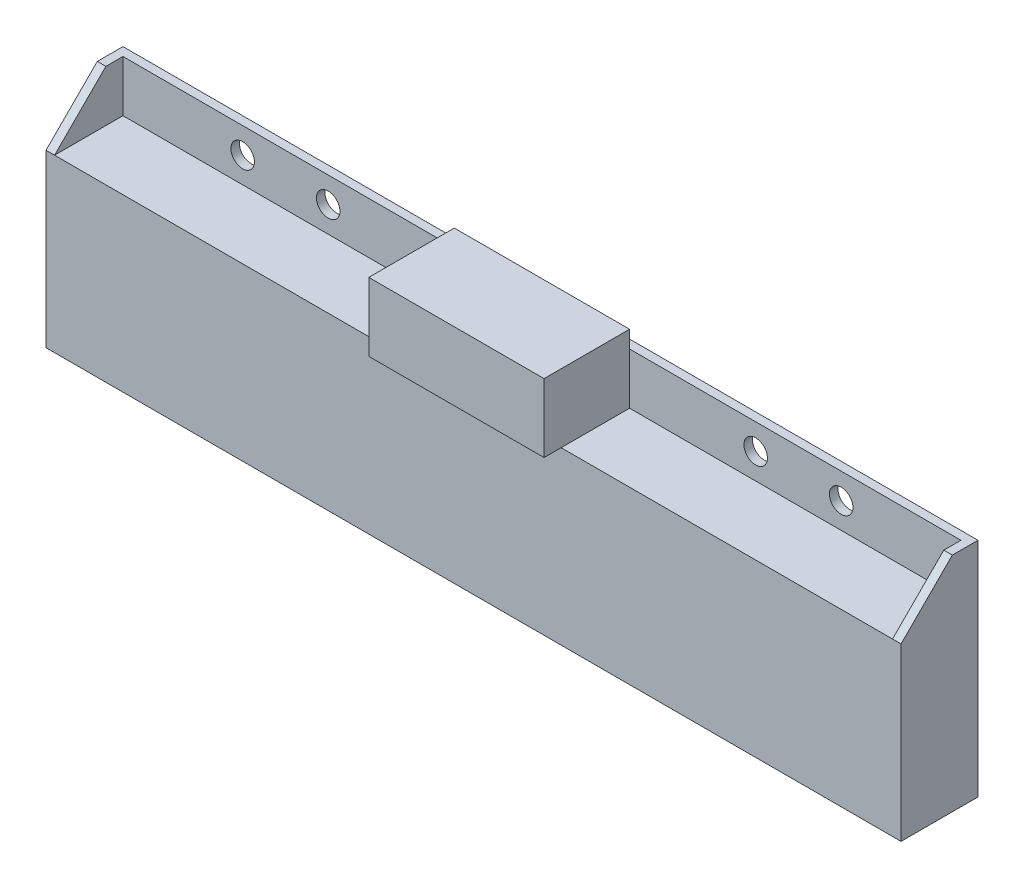
ISO-10303-21;
HEADER;
FILE_DESCRIPTION(('STEP AP214'),'2;1');
FILE_NAME('part.step','',(''),(''),'','','');
FILE_SCHEMA(('AUTOMOTIVE_DESIGN { 1 0 10303 214 1 1 1 1 }'));
ENDSEC;
DATA;
#1=APPLICATION_CONTEXT('core data for automotive mechanical design processes');
#2=APPLICATION_PROTOCOL_DEFINITION('international standard','automotive_design',2000,#1);
#3=PRODUCT_CONTEXT('',#1,'mechanical');
#4=PRODUCT('Part','Part','',(#3));
#5=PRODUCT_RELATED_PRODUCT_CATEGORY('part','',(#4));
#6=PRODUCT_DEFINITION_FORMATION('','',#4);
#7=PRODUCT_DEFINITION_CONTEXT('part definition',#1,'design');
#8=PRODUCT_DEFINITION('design','',#6,#7);
#9=PRODUCT_DEFINITION_SHAPE('','',#8);
#10=(LENGTH_UNIT() NAMED_UNIT(*) SI_UNIT(.MILLI.,.METRE.));
#11=(NAMED_UNIT(*) PLANE_ANGLE_UNIT() SI_UNIT($,.RADIAN.));
#12=(NAMED_UNIT(*) SI_UNIT($,.STERADIAN.) SOLID_ANGLE_UNIT());
#13=UNCERTAINTY_MEASURE_WITH_UNIT(LENGTH_MEASURE(1.E-05),#10,'distance_accuracy_value','');
#14=(GEOMETRIC_REPRESENTATION_CONTEXT(3) GLOBAL_UNCERTAINTY_ASSIGNED_CONTEXT((#13)) GLOBAL_UNIT_ASSIGNED_CONTEXT((#10,
#11,#12)) REPRESENTATION_CONTEXT('',''));
#15=CARTESIAN_POINT('',(0.,0.,0.));
#16=DIRECTION('',(0.,0.,1.));
#17=DIRECTION('',(1.,0.,0.));
#18=AXIS2_PLACEMENT_3D('',#15,#16,#17);
#19=CARTESIAN_POINT('',(-98.,14.,-196.367003338137));
#20=DIRECTION('',(0.,-1.,0.));
#21=DIRECTION('',(0.,0.,-1.));
#22=AXIS2_PLACEMENT_3D('',#19,#20,#21);
#23=PLANE('',#22);
#24=DIRECTION('',(0.,0.,-1.));
#25=VECTOR('',#24,1.);
#26=CARTESIAN_POINT('',(-20.5,14.,22.));
#27=LINE('',#26,#25);
#28=CARTESIAN_POINT('',(-20.5,14.,18.));
#29=VERTEX_POINT('',#28);
#30=CARTESIAN_POINT('',(-20.5,14.,2.));
#31=VERTEX_POINT('',#30);
#32=EDGE_CURVE('E170',#29,#31,#27,.T.);
#33=ORIENTED_EDGE('',*,*,#32,.T.);
#34=DIRECTION('',(-1.,0.,0.));
#35=VECTOR('',#34,1.);
#36=CARTESIAN_POINT('',(-98.,14.,2.));
#37=LINE('',#36,#35);
#38=CARTESIAN_POINT('',(-98.,14.,2.));
#39=VERTEX_POINT('',#38);
#40=EDGE_CURVE('E212',#31,#39,#37,.T.);
#41=ORIENTED_EDGE('',*,*,#40,.T.);
#42=DIRECTION('',(0.,0.,1.));
#43=VECTOR('',#42,1.);
#44=CARTESIAN_POINT('',(-98.,14.,-196.367003338137));
#45=LINE('',#44,#43);
#46=CARTESIAN_POINT('',(-98.,14.,18.));
#47=VERTEX_POINT('',#46);
#48=EDGE_CURVE('E59',#39,#47,#45,.T.);
#49=ORIENTED_EDGE('',*,*,#48,.T.);
#50=DIRECTION('',(1.,0.,0.));
#51=VECTOR('',#50,1.);
#52=CARTESIAN_POINT('',(-98.,14.,18.));
#53=LINE('',#52,#51);
#54=EDGE_CURVE('E213',#47,#29,#53,.T.);
#55=ORIENTED_EDGE('',*,*,#54,.T.);
#56=EDGE_LOOP('',(#33,#41,#49,#55));
#57=FACE_BOUND('',#56,.T.);
#58=ADVANCED_FACE('F36',(#57),#23,.F.);
#59=DIRECTION('',(0.,0.,-1.));
#60=VECTOR('',#59,1.);
#61=CARTESIAN_POINT('',(20.5,14.,22.));
#62=LINE('',#61,#60);
#63=CARTESIAN_POINT('',(20.5,14.,18.));
#64=VERTEX_POINT('',#63);
#65=CARTESIAN_POINT('',(20.5,14.,2.));
#66=VERTEX_POINT('',#65);
#67=EDGE_CURVE('E51',#64,#66,#62,.T.);
#68=ORIENTED_EDGE('',*,*,#67,.F.);
#69=CARTESIAN_POINT('',(98.,14.,18.));
#70=VERTEX_POINT('',#69);
#71=EDGE_CURVE('E201',#64,#70,#53,.T.);
#72=ORIENTED_EDGE('',*,*,#71,.T.);
#73=DIRECTION('',(0.,0.,1.));
#74=VECTOR('',#73,1.);
#75=CARTESIAN_POINT('',(98.,14.,-196.367003338137));
#76=LINE('',#75,#74);
#77=CARTESIAN_POINT('',(98.,14.,2.));
#78=VERTEX_POINT('',#77);
#79=EDGE_CURVE('E219',#78,#70,#76,.T.);
#80=ORIENTED_EDGE('',*,*,#79,.F.);
#81=EDGE_CURVE('E223',#78,#66,#37,.T.);
#82=ORIENTED_EDGE('',*,*,#81,.T.);
#83=EDGE_LOOP('',(#68,#72,#80,#82));
#84=FACE_BOUND('',#83,.T.);
#85=ADVANCED_FACE('F313',(#84),#23,.F.);
#86=CARTESIAN_POINT('',(0.,0.,2.));
#87=DIRECTION('',(0.,0.,1.));
#88=DIRECTION('',(1.,0.,0.));
#89=AXIS2_PLACEMENT_3D('',#86,#87,#88);
#90=PLANE('',#89);
#91=CARTESIAN_POINT('',(-50.,20.,2.));
#92=DIRECTION('',(0.,0.,1.));
#93=DIRECTION('',(1.,0.,0.));
#94=AXIS2_PLACEMENT_3D('',#91,#92,#93);
#95=CIRCLE('',#94,2.75);
#96=CARTESIAN_POINT('',(-47.25,20.,2.));
#97=VERTEX_POINT('',#96);
#98=EDGE_CURVE('E173',#97,#97,#95,.T.);
#99=ORIENTED_EDGE('',*,*,#98,.F.);
#100=EDGE_LOOP('',(#99));
#101=FACE_BOUND('',#100,.T.);
#102=CARTESIAN_POINT('',(-70.,20.,2.));
#103=DIRECTION('',(0.,0.,1.));
#104=DIRECTION('',(1.,0.,0.));
#105=AXIS2_PLACEMENT_3D('',#102,#103,#104);
#106=CIRCLE('',#105,2.75);
#107=CARTESIAN_POINT('',(-67.25,20.,2.));
#108=VERTEX_POINT('',#107);
#109=EDGE_CURVE('E195',#108,#108,#106,.T.);
#110=ORIENTED_EDGE('',*,*,#109,.F.);
#111=EDGE_LOOP('',(#110));
#112=FACE_BOUND('',#111,.T.);
#113=ORIENTED_EDGE('',*,*,#40,.F.);
#114=DIRECTION('',(0.,1.,0.));
#115=VECTOR('',#114,1.);
#116=CARTESIAN_POINT('',(-20.5,0.,2.));
#117=LINE('',#116,#115);
#118=CARTESIAN_POINT('',(-20.5,26.,2.));
#119=VERTEX_POINT('',#118);
#120=EDGE_CURVE('E12',#31,#119,#117,.T.);
#121=ORIENTED_EDGE('',*,*,#120,.T.);
#122=DIRECTION('',(1.,0.,0.));
#123=VECTOR('',#122,1.);
#124=CARTESIAN_POINT('',(-98.,26.,2.));
#125=LINE('',#124,#123);
#126=CARTESIAN_POINT('',(-98.,26.,2.));
#127=VERTEX_POINT('',#126);
#128=EDGE_CURVE('E206',#127,#119,#125,.T.);
#129=ORIENTED_EDGE('',*,*,#128,.F.);
#130=DIRECTION('',(0.,1.,0.));
#131=VECTOR('',#130,1.);
#132=CARTESIAN_POINT('',(-98.,14.,2.));
#133=LINE('',#132,#131);
#134=EDGE_CURVE('E209',#39,#127,#133,.T.);
#135=ORIENTED_EDGE('',*,*,#134,.F.);
#136=EDGE_LOOP('',(#113,#121,#129,#135));
#137=FACE_BOUND('',#136,.T.);
#138=ADVANCED_FACE('F352',(#101,#112,#137),#90,.T.);
#139=CARTESIAN_POINT('',(70.,20.,2.));
#140=DIRECTION('',(0.,0.,1.));
#141=DIRECTION('',(1.,0.,0.));
#142=AXIS2_PLACEMENT_3D('',#139,#140,#141);
#143=CIRCLE('',#142,2.75);
#144=CARTESIAN_POINT('',(72.75,20.,2.));
#145=VERTEX_POINT('',#144);
#146=EDGE_CURVE('E189',#145,#145,#143,.T.);
#147=ORIENTED_EDGE('',*,*,#146,.F.);
#148=EDGE_LOOP('',(#147));
#149=FACE_BOUND('',#148,.T.);
#150=CARTESIAN_POINT('',(50.,20.,2.));
#151=DIRECTION('',(0.,0.,1.));
#152=DIRECTION('',(1.,0.,0.));
#153=AXIS2_PLACEMENT_3D('',#150,#151,#152);
#154=CIRCLE('',#153,2.75);
#155=CARTESIAN_POINT('',(52.75,20.,2.));
#156=VERTEX_POINT('',#155);
#157=EDGE_CURVE('E183',#156,#156,#154,.T.);
#158=ORIENTED_EDGE('',*,*,#157,.F.);
#159=EDGE_LOOP('',(#158));
#160=FACE_BOUND('',#159,.T.);
#161=CARTESIAN_POINT('',(20.5,26.,2.));
#162=VERTEX_POINT('',#161);
#163=CARTESIAN_POINT('',(98.,26.,2.));
#164=VERTEX_POINT('',#163);
#165=EDGE_CURVE('E204',#162,#164,#125,.T.);
#166=ORIENTED_EDGE('',*,*,#165,.F.);
#167=DIRECTION('',(0.,1.,0.));
#168=VECTOR('',#167,1.);
#169=CARTESIAN_POINT('',(20.5,30.,2.));
#170=LINE('',#169,#168);
#171=EDGE_CURVE('E323',#66,#162,#170,.T.);
#172=ORIENTED_EDGE('',*,*,#171,.F.);
#173=ORIENTED_EDGE('',*,*,#81,.F.);
#174=DIRECTION('',(0.,-1.,0.));
#175=VECTOR('',#174,1.);
#176=CARTESIAN_POINT('',(98.,14.,2.));
#177=LINE('',#176,#175);
#178=EDGE_CURVE('E202',#164,#78,#177,.T.);
#179=ORIENTED_EDGE('',*,*,#178,.F.);
#180=EDGE_LOOP('',(#166,#172,#173,#179));
#181=FACE_BOUND('',#180,.T.);
#182=ADVANCED_FACE('F311',(#149,#160,#181),#90,.T.);
#183=CARTESIAN_POINT('',(100.,14.,18.));
#184=DIRECTION('',(0.,-0.707106781186548,-0.707106781186547));
#185=DIRECTION('',(0.,0.707106781186547,-0.707106781186548));
#186=AXIS2_PLACEMENT_3D('',#183,#184,#185);
#187=PLANE('',#186);
#188=DIRECTION('',(-1.,0.,0.));
#189=VECTOR('',#188,1.);
#190=CARTESIAN_POINT('',(100.,14.,18.));
#191=LINE('',#190,#189);
#192=CARTESIAN_POINT('',(-100.,14.,18.));
#193=VERTEX_POINT('',#192);
#194=EDGE_CURVE('E237',#47,#193,#191,.T.);
#195=ORIENTED_EDGE('',*,*,#194,.F.);
#196=DIRECTION('',(0.,0.707106781186547,-0.707106781186548));
#197=VECTOR('',#196,1.);
#198=CARTESIAN_POINT('',(-98.,14.,18.));
#199=LINE('',#198,#197);
#200=CARTESIAN_POINT('',(-98.,26.,6.00000000000001));
#201=VERTEX_POINT('',#200);
#202=EDGE_CURVE('E44',#47,#201,#199,.T.);
#203=ORIENTED_EDGE('',*,*,#202,.T.);
#204=DIRECTION('',(-1.,0.,0.));
#205=VECTOR('',#204,1.);
#206=CARTESIAN_POINT('',(100.,26.,6.));
#207=LINE('',#206,#205);
#208=CARTESIAN_POINT('',(-100.,26.,6.));
#209=VERTEX_POINT('',#208);
#210=EDGE_CURVE('E230',#201,#209,#207,.T.);
#211=ORIENTED_EDGE('',*,*,#210,.T.);
#212=DIRECTION('',(0.,-0.707106781186547,0.707106781186548));
#213=VECTOR('',#212,1.);
#214=CARTESIAN_POINT('',(-100.,14.,18.));
#215=LINE('',#214,#213);
#216=EDGE_CURVE('E226',#209,#193,#215,.T.);
#217=ORIENTED_EDGE('',*,*,#216,.T.);
#218=EDGE_LOOP('',(#195,#203,#211,#217));
#219=FACE_BOUND('',#218,.T.);
#220=ADVANCED_FACE('F274',(#219),#187,.F.);
#221=CARTESIAN_POINT('',(-100.,-26.,18.));
#222=DIRECTION('',(1.,0.,0.));
#223=DIRECTION('',(0.,0.,-1.));
#224=AXIS2_PLACEMENT_3D('',#221,#222,#223);
#225=PLANE('',#224);
#226=DIRECTION('',(0.,-1.,0.));
#227=VECTOR('',#226,1.);
#228=CARTESIAN_POINT('',(-100.,-26.,18.));
#229=LINE('',#228,#227);
#230=CARTESIAN_POINT('',(-100.,-26.,18.));
#231=VERTEX_POINT('',#230);
#232=EDGE_CURVE('E241',#193,#231,#229,.T.);
#233=ORIENTED_EDGE('',*,*,#232,.F.);
#234=ORIENTED_EDGE('',*,*,#216,.F.);
#235=DIRECTION('',(0.,0.,-1.));
#236=VECTOR('',#235,1.);
#237=CARTESIAN_POINT('',(-100.,26.,18.));
#238=LINE('',#237,#236);
#239=CARTESIAN_POINT('',(-100.,26.,0.));
#240=VERTEX_POINT('',#239);
#241=EDGE_CURVE('E249',#209,#240,#238,.T.);
#242=ORIENTED_EDGE('',*,*,#241,.T.);
#243=DIRECTION('',(0.,-1.,0.));
#244=VECTOR('',#243,1.);
#245=CARTESIAN_POINT('',(-100.,-26.,0.));
#246=LINE('',#245,#244);
#247=CARTESIAN_POINT('',(-100.,-26.,0.));
#248=VERTEX_POINT('',#247);
#249=EDGE_CURVE('E236',#240,#248,#246,.T.);
#250=ORIENTED_EDGE('',*,*,#249,.T.);
#251=DIRECTION('',(0.,0.,-1.));
#252=VECTOR('',#251,1.);
#253=CARTESIAN_POINT('',(-100.,-26.,18.));
#254=LINE('',#253,#252);
#255=EDGE_CURVE('E265',#231,#248,#254,.T.);
#256=ORIENTED_EDGE('',*,*,#255,.F.);
#257=EDGE_LOOP('',(#233,#234,#242,#250,#256));
#258=FACE_BOUND('',#257,.T.);
#259=ADVANCED_FACE('F38',(#258),#225,.F.);
#260=CARTESIAN_POINT('',(100.,-26.,18.));
#261=DIRECTION('',(0.,1.,0.));
#262=DIRECTION('',(-1.,0.,0.));
#263=AXIS2_PLACEMENT_3D('',#260,#261,#262);
#264=PLANE('',#263);
#265=DIRECTION('',(1.,0.,0.));
#266=VECTOR('',#265,1.);
#267=CARTESIAN_POINT('',(100.,-26.,0.));
#268=LINE('',#267,#266);
#269=CARTESIAN_POINT('',(100.,-26.,0.));
#270=VERTEX_POINT('',#269);
#271=EDGE_CURVE('E252',#248,#270,#268,.T.);
#272=ORIENTED_EDGE('',*,*,#271,.T.);
#273=DIRECTION('',(0.,0.,-1.));
#274=VECTOR('',#273,1.);
#275=CARTESIAN_POINT('',(100.,-26.,18.));
#276=LINE('',#275,#274);
#277=CARTESIAN_POINT('',(100.,-26.,18.));
#278=VERTEX_POINT('',#277);
#279=EDGE_CURVE('E262',#278,#270,#276,.T.);
#280=ORIENTED_EDGE('',*,*,#279,.F.);
#281=DIRECTION('',(1.,0.,0.));
#282=VECTOR('',#281,1.);
#283=CARTESIAN_POINT('',(100.,-26.,18.));
#284=LINE('',#283,#282);
#285=EDGE_CURVE('E243',#231,#278,#284,.T.);
#286=ORIENTED_EDGE('',*,*,#285,.F.);
#287=ORIENTED_EDGE('',*,*,#255,.T.);
#288=EDGE_LOOP('',(#272,#280,#286,#287));
#289=FACE_BOUND('',#288,.T.);
#290=ADVANCED_FACE('F292',(#289),#264,.F.);
#291=CARTESIAN_POINT('',(100.,-26.,18.));
#292=DIRECTION('',(-1.,0.,0.));
#293=DIRECTION('',(0.,0.,1.));
#294=AXIS2_PLACEMENT_3D('',#291,#292,#293);
#295=PLANE('',#294);
#296=DIRECTION('',(0.,0.,-1.));
#297=VECTOR('',#296,1.);
#298=CARTESIAN_POINT('',(100.,26.,18.));
#299=LINE('',#298,#297);
#300=CARTESIAN_POINT('',(100.,26.,6.));
#301=VERTEX_POINT('',#300);
#302=CARTESIAN_POINT('',(100.,26.,0.));
#303=VERTEX_POINT('',#302);
#304=EDGE_CURVE('E260',#301,#303,#299,.T.);
#305=ORIENTED_EDGE('',*,*,#304,.F.);
#306=DIRECTION('',(0.,-0.707106781186547,0.707106781186548));
#307=VECTOR('',#306,1.);
#308=CARTESIAN_POINT('',(100.,14.,18.));
#309=LINE('',#308,#307);
#310=CARTESIAN_POINT('',(100.,14.,18.));
#311=VERTEX_POINT('',#310);
#312=EDGE_CURVE('E227',#301,#311,#309,.T.);
#313=ORIENTED_EDGE('',*,*,#312,.T.);
#314=DIRECTION('',(0.,1.,0.));
#315=VECTOR('',#314,1.);
#316=CARTESIAN_POINT('',(100.,-26.,18.));
#317=LINE('',#316,#315);
#318=EDGE_CURVE('E246',#278,#311,#317,.T.);
#319=ORIENTED_EDGE('',*,*,#318,.F.);
#320=ORIENTED_EDGE('',*,*,#279,.T.);
#321=DIRECTION('',(0.,1.,0.));
#322=VECTOR('',#321,1.);
#323=CARTESIAN_POINT('',(100.,-26.,0.));
#324=LINE('',#323,#322);
#325=EDGE_CURVE('E254',#270,#303,#324,.T.);
#326=ORIENTED_EDGE('',*,*,#325,.T.);
#327=EDGE_LOOP('',(#305,#313,#319,#320,#326));
#328=FACE_BOUND('',#327,.T.);
#329=ADVANCED_FACE('F297',(#328),#295,.F.);
#330=CARTESIAN_POINT('',(100.,26.,18.));
#331=DIRECTION('',(0.,-1.,0.));
#332=DIRECTION('',(1.,0.,0.));
#333=AXIS2_PLACEMENT_3D('',#330,#331,#332);
#334=PLANE('',#333);
#335=ORIENTED_EDGE('',*,*,#210,.F.);
#336=DIRECTION('',(0.,0.,1.));
#337=VECTOR('',#336,1.);
#338=CARTESIAN_POINT('',(-98.,26.,-196.367003338137));
#339=LINE('',#338,#337);
#340=EDGE_CURVE('E205',#127,#201,#339,.T.);
#341=ORIENTED_EDGE('',*,*,#340,.F.);
#342=ORIENTED_EDGE('',*,*,#128,.T.);
#343=EDGE_CURVE('E210',#119,#162,#125,.T.);
#344=ORIENTED_EDGE('',*,*,#343,.T.);
#345=ORIENTED_EDGE('',*,*,#165,.T.);
#346=DIRECTION('',(0.,0.,1.));
#347=VECTOR('',#346,1.);
#348=CARTESIAN_POINT('',(98.,26.,-196.367003338137));
#349=LINE('',#348,#347);
#350=CARTESIAN_POINT('',(98.,26.,5.99999999999998));
#351=VERTEX_POINT('',#350);
#352=EDGE_CURVE('E216',#164,#351,#349,.T.);
#353=ORIENTED_EDGE('',*,*,#352,.T.);
#354=EDGE_CURVE('E238',#301,#351,#207,.T.);
#355=ORIENTED_EDGE('',*,*,#354,.F.);
#356=ORIENTED_EDGE('',*,*,#304,.T.);
#357=DIRECTION('',(-1.,0.,0.));
#358=VECTOR('',#357,1.);
#359=CARTESIAN_POINT('',(100.,26.,0.));
#360=LINE('',#359,#358);
#361=EDGE_CURVE('E244',#303,#240,#360,.T.);
#362=ORIENTED_EDGE('',*,*,#361,.T.);
#363=ORIENTED_EDGE('',*,*,#241,.F.);
#364=EDGE_LOOP('',(#335,#341,#342,#344,#345,#353,#355,#356,#362,#363));
#365=FACE_BOUND('',#364,.T.);
#366=ADVANCED_FACE('F281',(#365),#334,.F.);
#367=CARTESIAN_POINT('',(0.,0.,18.));
#368=DIRECTION('',(0.,0.,1.));
#369=DIRECTION('',(1.,0.,0.));
#370=AXIS2_PLACEMENT_3D('',#367,#368,#369);
#371=PLANE('',#370);
#372=EDGE_CURVE('E233',#311,#70,#191,.T.);
#373=ORIENTED_EDGE('',*,*,#372,.T.);
#374=ORIENTED_EDGE('',*,*,#71,.F.);
#375=DIRECTION('',(-1.,0.,0.));
#376=VECTOR('',#375,1.);
#377=CARTESIAN_POINT('',(0.,14.,18.));
#378=LINE('',#377,#376);
#379=EDGE_CURVE('E171',#64,#29,#378,.T.);
#380=ORIENTED_EDGE('',*,*,#379,.T.);
#381=ORIENTED_EDGE('',*,*,#54,.F.);
#382=ORIENTED_EDGE('',*,*,#194,.T.);
#383=ORIENTED_EDGE('',*,*,#232,.T.);
#384=ORIENTED_EDGE('',*,*,#285,.T.);
#385=ORIENTED_EDGE('',*,*,#318,.T.);
#386=EDGE_LOOP('',(#373,#374,#380,#381,#382,#383,#384,#385));
#387=FACE_BOUND('',#386,.T.);
#388=ADVANCED_FACE('F289',(#387),#371,.T.);
#389=CARTESIAN_POINT('',(0.,0.,0.));
#390=DIRECTION('',(0.,0.,1.));
#391=DIRECTION('',(1.,0.,0.));
#392=AXIS2_PLACEMENT_3D('',#389,#390,#391);
#393=PLANE('',#392);
#394=CARTESIAN_POINT('',(-50.,20.,0.));
#395=DIRECTION('',(0.,0.,1.));
#396=DIRECTION('',(1.,0.,0.));
#397=AXIS2_PLACEMENT_3D('',#394,#395,#396);
#398=CIRCLE('',#397,2.75);
#399=CARTESIAN_POINT('',(-47.25,20.,0.));
#400=VERTEX_POINT('',#399);
#401=EDGE_CURVE('E180',#400,#400,#398,.T.);
#402=ORIENTED_EDGE('',*,*,#401,.T.);
#403=EDGE_LOOP('',(#402));
#404=FACE_BOUND('',#403,.T.);
#405=CARTESIAN_POINT('',(50.,20.,0.));
#406=DIRECTION('',(0.,0.,1.));
#407=DIRECTION('',(1.,0.,0.));
#408=AXIS2_PLACEMENT_3D('',#405,#406,#407);
#409=CIRCLE('',#408,2.75);
#410=CARTESIAN_POINT('',(52.75,20.,0.));
#411=VERTEX_POINT('',#410);
#412=EDGE_CURVE('E186',#411,#411,#409,.T.);
#413=ORIENTED_EDGE('',*,*,#412,.T.);
#414=EDGE_LOOP('',(#413));
#415=FACE_BOUND('',#414,.T.);
#416=CARTESIAN_POINT('',(70.,20.,0.));
#417=DIRECTION('',(0.,0.,1.));
#418=DIRECTION('',(1.,0.,0.));
#419=AXIS2_PLACEMENT_3D('',#416,#417,#418);
#420=CIRCLE('',#419,2.75);
#421=CARTESIAN_POINT('',(72.75,20.,0.));
#422=VERTEX_POINT('',#421);
#423=EDGE_CURVE('E192',#422,#422,#420,.T.);
#424=ORIENTED_EDGE('',*,*,#423,.T.);
#425=EDGE_LOOP('',(#424));
#426=FACE_BOUND('',#425,.T.);
#427=CARTESIAN_POINT('',(-70.,20.,0.));
#428=DIRECTION('',(0.,0.,1.));
#429=DIRECTION('',(1.,0.,0.));
#430=AXIS2_PLACEMENT_3D('',#427,#428,#429);
#431=CIRCLE('',#430,2.75);
#432=CARTESIAN_POINT('',(-67.25,20.,0.));
#433=VERTEX_POINT('',#432);
#434=EDGE_CURVE('E198',#433,#433,#431,.T.);
#435=ORIENTED_EDGE('',*,*,#434,.T.);
#436=EDGE_LOOP('',(#435));
#437=FACE_BOUND('',#436,.T.);
#438=ORIENTED_EDGE('',*,*,#249,.F.);
#439=ORIENTED_EDGE('',*,*,#361,.F.);
#440=ORIENTED_EDGE('',*,*,#325,.F.);
#441=ORIENTED_EDGE('',*,*,#271,.F.);
#442=EDGE_LOOP('',(#438,#439,#440,#441));
#443=FACE_BOUND('',#442,.T.);
#444=ADVANCED_FACE('F361',(#404,#415,#426,#437,#443),#393,.F.);
#445=ORIENTED_EDGE('',*,*,#354,.T.);
#446=DIRECTION('',(0.,-0.707106781186547,0.707106781186548));
#447=VECTOR('',#446,1.);
#448=CARTESIAN_POINT('',(98.,14.,18.));
#449=LINE('',#448,#447);
#450=EDGE_CURVE('E268',#351,#70,#449,.T.);
#451=ORIENTED_EDGE('',*,*,#450,.T.);
#452=ORIENTED_EDGE('',*,*,#372,.F.);
#453=ORIENTED_EDGE('',*,*,#312,.F.);
#454=EDGE_LOOP('',(#445,#451,#452,#453));
#455=FACE_BOUND('',#454,.T.);
#456=ADVANCED_FACE('F300',(#455),#187,.F.);
#457=CARTESIAN_POINT('',(-98.,14.,-196.367003338137));
#458=DIRECTION('',(-1.,0.,0.));
#459=DIRECTION('',(0.,0.,1.));
#460=AXIS2_PLACEMENT_3D('',#457,#458,#459);
#461=PLANE('',#460);
#462=ORIENTED_EDGE('',*,*,#48,.F.);
#463=ORIENTED_EDGE('',*,*,#134,.T.);
#464=ORIENTED_EDGE('',*,*,#340,.T.);
#465=ORIENTED_EDGE('',*,*,#202,.F.);
#466=EDGE_LOOP('',(#462,#463,#464,#465));
#467=FACE_BOUND('',#466,.T.);
#468=ADVANCED_FACE('F356',(#467),#461,.F.);
#469=CARTESIAN_POINT('',(98.,14.,-196.367003338137));
#470=DIRECTION('',(1.,0.,0.));
#471=DIRECTION('',(0.,0.,-1.));
#472=AXIS2_PLACEMENT_3D('',#469,#470,#471);
#473=PLANE('',#472);
#474=ORIENTED_EDGE('',*,*,#352,.F.);
#475=ORIENTED_EDGE('',*,*,#178,.T.);
#476=ORIENTED_EDGE('',*,*,#79,.T.);
#477=ORIENTED_EDGE('',*,*,#450,.F.);
#478=EDGE_LOOP('',(#474,#475,#476,#477));
#479=FACE_BOUND('',#478,.T.);
#480=ADVANCED_FACE('F304',(#479),#473,.F.);
#481=CARTESIAN_POINT('',(-70.,20.,2.));
#482=DIRECTION('',(0.,0.,1.));
#483=DIRECTION('',(1.,0.,0.));
#484=AXIS2_PLACEMENT_3D('',#481,#482,#483);
#485=CYLINDRICAL_SURFACE('',#484,2.75);
#486=ORIENTED_EDGE('',*,*,#434,.F.);
#487=EDGE_LOOP('',(#486));
#488=FACE_BOUND('',#487,.T.);
#489=ORIENTED_EDGE('',*,*,#109,.T.);
#490=EDGE_LOOP('',(#489));
#491=FACE_BOUND('',#490,.T.);
#492=ADVANCED_FACE('F388',(#488,#491),#485,.F.);
#493=CARTESIAN_POINT('',(70.,20.,2.));
#494=DIRECTION('',(0.,0.,1.));
#495=DIRECTION('',(1.,0.,0.));
#496=AXIS2_PLACEMENT_3D('',#493,#494,#495);
#497=CYLINDRICAL_SURFACE('',#496,2.75);
#498=ORIENTED_EDGE('',*,*,#423,.F.);
#499=EDGE_LOOP('',(#498));
#500=FACE_BOUND('',#499,.T.);
#501=ORIENTED_EDGE('',*,*,#146,.T.);
#502=EDGE_LOOP('',(#501));
#503=FACE_BOUND('',#502,.T.);
#504=ADVANCED_FACE('F391',(#500,#503),#497,.F.);
#505=CARTESIAN_POINT('',(50.,20.,2.));
#506=DIRECTION('',(0.,0.,1.));
#507=DIRECTION('',(1.,0.,0.));
#508=AXIS2_PLACEMENT_3D('',#505,#506,#507);
#509=CYLINDRICAL_SURFACE('',#508,2.75);
#510=ORIENTED_EDGE('',*,*,#412,.F.);
#511=EDGE_LOOP('',(#510));
#512=FACE_BOUND('',#511,.T.);
#513=ORIENTED_EDGE('',*,*,#157,.T.);
#514=EDGE_LOOP('',(#513));
#515=FACE_BOUND('',#514,.T.);
#516=ADVANCED_FACE('F342',(#512,#515),#509,.F.);
#517=CARTESIAN_POINT('',(-50.,20.,2.));
#518=DIRECTION('',(0.,0.,1.));
#519=DIRECTION('',(1.,0.,0.));
#520=AXIS2_PLACEMENT_3D('',#517,#518,#519);
#521=CYLINDRICAL_SURFACE('',#520,2.75);
#522=ORIENTED_EDGE('',*,*,#401,.F.);
#523=EDGE_LOOP('',(#522));
#524=FACE_BOUND('',#523,.T.);
#525=ORIENTED_EDGE('',*,*,#98,.T.);
#526=EDGE_LOOP('',(#525));
#527=FACE_BOUND('',#526,.T.);
#528=ADVANCED_FACE('F335',(#524,#527),#521,.F.);
#529=CARTESIAN_POINT('',(0.,0.,2.));
#530=DIRECTION('',(0.,0.,1.));
#531=DIRECTION('',(1.,0.,0.));
#532=AXIS2_PLACEMENT_3D('',#529,#530,#531);
#533=PLANE('',#532);
#534=CARTESIAN_POINT('',(20.5,30.,2.));
#535=VERTEX_POINT('',#534);
#536=EDGE_CURVE('E325',#162,#535,#170,.T.);
#537=ORIENTED_EDGE('',*,*,#536,.F.);
#538=ORIENTED_EDGE('',*,*,#343,.F.);
#539=DIRECTION('',(0.,-1.,0.));
#540=VECTOR('',#539,1.);
#541=CARTESIAN_POINT('',(-20.5,30.,2.));
#542=LINE('',#541,#540);
#543=CARTESIAN_POINT('',(-20.5,30.,2.));
#544=VERTEX_POINT('',#543);
#545=EDGE_CURVE('E326',#544,#119,#542,.T.);
#546=ORIENTED_EDGE('',*,*,#545,.F.);
#547=DIRECTION('',(-1.,0.,0.));
#548=VECTOR('',#547,1.);
#549=CARTESIAN_POINT('',(-20.5,30.,2.));
#550=LINE('',#549,#548);
#551=EDGE_CURVE('E165',#535,#544,#550,.T.);
#552=ORIENTED_EDGE('',*,*,#551,.F.);
#553=EDGE_LOOP('',(#537,#538,#546,#552));
#554=FACE_BOUND('',#553,.T.);
#555=ADVANCED_FACE('F333',(#554),#533,.F.);
#556=CARTESIAN_POINT('',(-20.5,30.,22.));
#557=DIRECTION('',(1.,0.,0.));
#558=DIRECTION('',(0.,1.,0.));
#559=AXIS2_PLACEMENT_3D('',#556,#557,#558);
#560=PLANE('',#559);
#561=ORIENTED_EDGE('',*,*,#545,.T.);
#562=ORIENTED_EDGE('',*,*,#120,.F.);
#563=ORIENTED_EDGE('',*,*,#32,.F.);
#564=CARTESIAN_POINT('',(-20.5,14.,22.));
#565=VERTEX_POINT('',#564);
#566=EDGE_CURVE('E150',#565,#29,#27,.T.);
#567=ORIENTED_EDGE('',*,*,#566,.F.);
#568=DIRECTION('',(0.,-1.,0.));
#569=VECTOR('',#568,1.);
#570=CARTESIAN_POINT('',(-20.5,30.,22.));
#571=LINE('',#570,#569);
#572=CARTESIAN_POINT('',(-20.5,30.,22.));
#573=VERTEX_POINT('',#572);
#574=EDGE_CURVE('E156',#573,#565,#571,.T.);
#575=ORIENTED_EDGE('',*,*,#574,.F.);
#576=DIRECTION('',(0.,0.,-1.));
#577=VECTOR('',#576,1.);
#578=CARTESIAN_POINT('',(-20.5,30.,22.));
#579=LINE('',#578,#577);
#580=EDGE_CURVE('E316',#573,#544,#579,.T.);
#581=ORIENTED_EDGE('',*,*,#580,.T.);
#582=EDGE_LOOP('',(#561,#562,#563,#567,#575,#581));
#583=FACE_BOUND('',#582,.T.);
#584=ADVANCED_FACE('F168',(#583),#560,.F.);
#585=CARTESIAN_POINT('',(-20.5,14.,22.));
#586=DIRECTION('',(0.,1.,0.));
#587=DIRECTION('',(0.,0.,1.));
#588=AXIS2_PLACEMENT_3D('',#585,#586,#587);
#589=PLANE('',#588);
#590=ORIENTED_EDGE('',*,*,#379,.F.);
#591=CARTESIAN_POINT('',(20.5,14.,22.));
#592=VERTEX_POINT('',#591);
#593=EDGE_CURVE('E152',#592,#64,#62,.T.);
#594=ORIENTED_EDGE('',*,*,#593,.F.);
#595=DIRECTION('',(1.,0.,0.));
#596=VECTOR('',#595,1.);
#597=CARTESIAN_POINT('',(-20.5,14.,22.));
#598=LINE('',#597,#596);
#599=EDGE_CURVE('E146',#565,#592,#598,.T.);
#600=ORIENTED_EDGE('',*,*,#599,.F.);
#601=ORIENTED_EDGE('',*,*,#566,.T.);
#602=EDGE_LOOP('',(#590,#594,#600,#601));
#603=FACE_BOUND('',#602,.T.);
#604=ADVANCED_FACE('F148',(#603),#589,.F.);
#605=CARTESIAN_POINT('',(20.5,30.,22.));
#606=DIRECTION('',(-1.,0.,0.));
#607=DIRECTION('',(0.,-1.,0.));
#608=AXIS2_PLACEMENT_3D('',#605,#606,#607);
#609=PLANE('',#608);
#610=ORIENTED_EDGE('',*,*,#171,.T.);
#611=ORIENTED_EDGE('',*,*,#536,.T.);
#612=DIRECTION('',(0.,0.,-1.));
#613=VECTOR('',#612,1.);
#614=CARTESIAN_POINT('',(20.5,30.,22.));
#615=LINE('',#614,#613);
#616=CARTESIAN_POINT('',(20.5,30.,22.));
#617=VERTEX_POINT('',#616);
#618=EDGE_CURVE('E314',#617,#535,#615,.T.);
#619=ORIENTED_EDGE('',*,*,#618,.F.);
#620=DIRECTION('',(0.,1.,0.));
#621=VECTOR('',#620,1.);
#622=CARTESIAN_POINT('',(20.5,30.,22.));
#623=LINE('',#622,#621);
#624=EDGE_CURVE('E155',#592,#617,#623,.T.);
#625=ORIENTED_EDGE('',*,*,#624,.F.);
#626=ORIENTED_EDGE('',*,*,#593,.T.);
#627=ORIENTED_EDGE('',*,*,#67,.T.);
#628=EDGE_LOOP('',(#610,#611,#619,#625,#626,#627));
#629=FACE_BOUND('',#628,.T.);
#630=ADVANCED_FACE('F329',(#629),#609,.F.);
#631=CARTESIAN_POINT('',(-20.5,30.,22.));
#632=DIRECTION('',(0.,-1.,0.));
#633=DIRECTION('',(0.,0.,-1.));
#634=AXIS2_PLACEMENT_3D('',#631,#632,#633);
#635=PLANE('',#634);
#636=ORIENTED_EDGE('',*,*,#551,.T.);
#637=ORIENTED_EDGE('',*,*,#580,.F.);
#638=DIRECTION('',(-1.,0.,0.));
#639=VECTOR('',#638,1.);
#640=CARTESIAN_POINT('',(-20.5,30.,22.));
#641=LINE('',#640,#639);
#642=EDGE_CURVE('E161',#617,#573,#641,.T.);
#643=ORIENTED_EDGE('',*,*,#642,.F.);
#644=ORIENTED_EDGE('',*,*,#618,.T.);
#645=EDGE_LOOP('',(#636,#637,#643,#644));
#646=FACE_BOUND('',#645,.T.);
#647=ADVANCED_FACE('F330',(#646),#635,.F.);
#648=CARTESIAN_POINT('',(0.,0.,22.));
#649=DIRECTION('',(0.,0.,1.));
#650=DIRECTION('',(1.,0.,0.));
#651=AXIS2_PLACEMENT_3D('',#648,#649,#650);
#652=PLANE('',#651);
#653=ORIENTED_EDGE('',*,*,#574,.T.);
#654=ORIENTED_EDGE('',*,*,#599,.T.);
#655=ORIENTED_EDGE('',*,*,#624,.T.);
#656=ORIENTED_EDGE('',*,*,#642,.T.);
#657=EDGE_LOOP('',(#653,#654,#655,#656));
#658=FACE_BOUND('',#657,.T.);
#659=ADVANCED_FACE('F159',(#658),#652,.T.);
#660=CLOSED_SHELL('',(#58,#85,#138,#182,#220,#259,#290,#329,#366,#388,#444,#456,#468,#480,#492,
#504,#516,#528,#555,#584,#604,#630,#647,#659));
#661=MANIFOLD_SOLID_BREP('B2',#660);
#662=ADVANCED_BREP_SHAPE_REPRESENTATION('',(#18,#661),#14);
#663=SHAPE_DEFINITION_REPRESENTATION(#9,#662);
ENDSEC;
END-ISO-10303-21;
